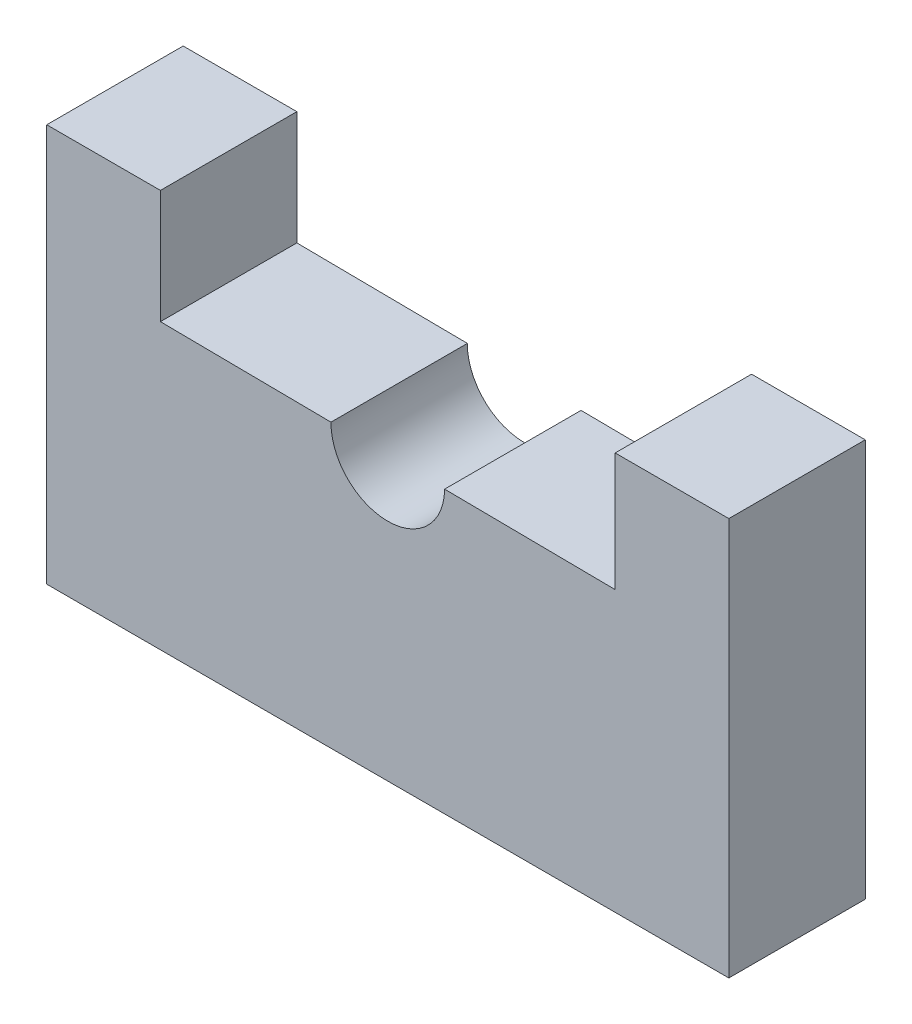
ISO-10303-21;
HEADER;
FILE_DESCRIPTION(('STEP AP214'),'2;1');
FILE_NAME('part.step','',(''),(''),'','','');
FILE_SCHEMA(('AUTOMOTIVE_DESIGN { 1 0 10303 214 1 1 1 1 }'));
ENDSEC;
DATA;
#1=APPLICATION_CONTEXT('core data for automotive mechanical design processes');
#2=APPLICATION_PROTOCOL_DEFINITION('international standard','automotive_design',2000,#1);
#3=PRODUCT_CONTEXT('',#1,'mechanical');
#4=PRODUCT('Part','Part','',(#3));
#5=PRODUCT_RELATED_PRODUCT_CATEGORY('part','',(#4));
#6=PRODUCT_DEFINITION_FORMATION('','',#4);
#7=PRODUCT_DEFINITION_CONTEXT('part definition',#1,'design');
#8=PRODUCT_DEFINITION('design','',#6,#7);
#9=PRODUCT_DEFINITION_SHAPE('','',#8);
#10=(LENGTH_UNIT() NAMED_UNIT(*) SI_UNIT(.MILLI.,.METRE.));
#11=(NAMED_UNIT(*) PLANE_ANGLE_UNIT() SI_UNIT($,.RADIAN.));
#12=(NAMED_UNIT(*) SI_UNIT($,.STERADIAN.) SOLID_ANGLE_UNIT());
#13=UNCERTAINTY_MEASURE_WITH_UNIT(LENGTH_MEASURE(1.E-05),#10,'distance_accuracy_value','');
#14=(GEOMETRIC_REPRESENTATION_CONTEXT(3) GLOBAL_UNCERTAINTY_ASSIGNED_CONTEXT((#13)) GLOBAL_UNIT_ASSIGNED_CONTEXT((#10,
#11,#12)) REPRESENTATION_CONTEXT('',''));
#15=CARTESIAN_POINT('',(0.,0.,0.));
#16=DIRECTION('',(0.,0.,1.));
#17=DIRECTION('',(1.,0.,0.));
#18=AXIS2_PLACEMENT_3D('',#15,#16,#17);
#19=CARTESIAN_POINT('',(34.1577060931899,16.9041218637993,6.));
#20=DIRECTION('',(-1.,0.,0.));
#21=DIRECTION('',(0.,-1.,0.));
#22=AXIS2_PLACEMENT_3D('',#19,#20,#21);
#23=PLANE('',#22);
#24=DIRECTION('',(0.,1.,0.));
#25=VECTOR('',#24,1.);
#26=CARTESIAN_POINT('',(34.1577060931899,16.9041218637993,-6.));
#27=LINE('',#26,#25);
#28=CARTESIAN_POINT('',(34.15770609319,-18.0958781362007,-6.));
#29=VERTEX_POINT('',#28);
#30=CARTESIAN_POINT('',(34.1577060931899,16.9041218637993,-6.));
#31=VERTEX_POINT('',#30);
#32=EDGE_CURVE('E158',#29,#31,#27,.T.);
#33=ORIENTED_EDGE('',*,*,#32,.T.);
#34=DIRECTION('',(0.,0.,-1.));
#35=VECTOR('',#34,1.);
#36=CARTESIAN_POINT('',(34.1577060931899,16.9041218637993,6.));
#37=LINE('',#36,#35);
#38=CARTESIAN_POINT('',(34.1577060931899,16.9041218637993,6.));
#39=VERTEX_POINT('',#38);
#40=EDGE_CURVE('E11',#39,#31,#37,.T.);
#41=ORIENTED_EDGE('',*,*,#40,.F.);
#42=DIRECTION('',(0.,1.,0.));
#43=VECTOR('',#42,1.);
#44=CARTESIAN_POINT('',(34.1577060931899,16.9041218637993,6.));
#45=LINE('',#44,#43);
#46=CARTESIAN_POINT('',(34.15770609319,-18.0958781362007,6.));
#47=VERTEX_POINT('',#46);
#48=EDGE_CURVE('E187',#47,#39,#45,.T.);
#49=ORIENTED_EDGE('',*,*,#48,.F.);
#50=DIRECTION('',(0.,0.,-1.));
#51=VECTOR('',#50,1.);
#52=CARTESIAN_POINT('',(34.15770609319,-18.0958781362007,6.));
#53=LINE('',#52,#51);
#54=EDGE_CURVE('E154',#47,#29,#53,.T.);
#55=ORIENTED_EDGE('',*,*,#54,.T.);
#56=EDGE_LOOP('',(#33,#41,#49,#55));
#57=FACE_BOUND('',#56,.T.);
#58=ADVANCED_FACE('F45',(#57),#23,.F.);
#59=CARTESIAN_POINT('',(24.15770609319,16.9041218637993,6.));
#60=DIRECTION('',(0.,-1.,0.));
#61=DIRECTION('',(0.,0.,-1.));
#62=AXIS2_PLACEMENT_3D('',#59,#60,#61);
#63=PLANE('',#62);
#64=DIRECTION('',(-1.,0.,0.));
#65=VECTOR('',#64,1.);
#66=CARTESIAN_POINT('',(24.15770609319,16.9041218637993,-6.));
#67=LINE('',#66,#65);
#68=CARTESIAN_POINT('',(24.15770609319,16.9041218637993,-6.));
#69=VERTEX_POINT('',#68);
#70=EDGE_CURVE('E162',#31,#69,#67,.T.);
#71=ORIENTED_EDGE('',*,*,#70,.T.);
#72=DIRECTION('',(0.,0.,-1.));
#73=VECTOR('',#72,1.);
#74=CARTESIAN_POINT('',(24.15770609319,16.9041218637993,6.));
#75=LINE('',#74,#73);
#76=CARTESIAN_POINT('',(24.15770609319,16.9041218637993,6.));
#77=VERTEX_POINT('',#76);
#78=EDGE_CURVE('E54',#77,#69,#75,.T.);
#79=ORIENTED_EDGE('',*,*,#78,.F.);
#80=DIRECTION('',(-1.,0.,0.));
#81=VECTOR('',#80,1.);
#82=CARTESIAN_POINT('',(24.15770609319,16.9041218637993,6.));
#83=LINE('',#82,#81);
#84=EDGE_CURVE('E111',#39,#77,#83,.T.);
#85=ORIENTED_EDGE('',*,*,#84,.F.);
#86=ORIENTED_EDGE('',*,*,#40,.T.);
#87=EDGE_LOOP('',(#71,#79,#85,#86));
#88=FACE_BOUND('',#87,.T.);
#89=ADVANCED_FACE('F216',(#88),#63,.F.);
#90=CARTESIAN_POINT('',(24.15770609319,6.49193548387097,6.));
#91=DIRECTION('',(1.,0.,0.));
#92=DIRECTION('',(0.,0.,-1.));
#93=AXIS2_PLACEMENT_3D('',#90,#91,#92);
#94=PLANE('',#93);
#95=DIRECTION('',(0.,-1.,0.));
#96=VECTOR('',#95,1.);
#97=CARTESIAN_POINT('',(24.15770609319,6.49193548387097,-6.));
#98=LINE('',#97,#96);
#99=CARTESIAN_POINT('',(24.15770609319,6.49193548387097,-6.));
#100=VERTEX_POINT('',#99);
#101=EDGE_CURVE('E166',#69,#100,#98,.T.);
#102=ORIENTED_EDGE('',*,*,#101,.T.);
#103=DIRECTION('',(0.,0.,-1.));
#104=VECTOR('',#103,1.);
#105=CARTESIAN_POINT('',(24.15770609319,6.49193548387097,6.));
#106=LINE('',#105,#104);
#107=CARTESIAN_POINT('',(24.15770609319,6.49193548387097,6.));
#108=VERTEX_POINT('',#107);
#109=EDGE_CURVE('E206',#108,#100,#106,.T.);
#110=ORIENTED_EDGE('',*,*,#109,.F.);
#111=DIRECTION('',(0.,-1.,0.));
#112=VECTOR('',#111,1.);
#113=CARTESIAN_POINT('',(24.15770609319,16.9041218637993,6.));
#114=LINE('',#113,#112);
#115=EDGE_CURVE('E215',#77,#108,#114,.T.);
#116=ORIENTED_EDGE('',*,*,#115,.F.);
#117=ORIENTED_EDGE('',*,*,#78,.T.);
#118=EDGE_LOOP('',(#102,#110,#116,#117));
#119=FACE_BOUND('',#118,.T.);
#120=ADVANCED_FACE('F213',(#119),#94,.F.);
#121=CARTESIAN_POINT('',(9.15744064931116,6.64650811165287,6.));
#122=DIRECTION('',(-0.0103041124364507,-0.999946911224239,0.));
#123=DIRECTION('',(0.999946911224239,-0.0103041124364507,0.));
#124=AXIS2_PLACEMENT_3D('',#121,#122,#123);
#125=PLANE('',#124);
#126=DIRECTION('',(-0.999946911224239,0.0103041124364507,0.));
#127=VECTOR('',#126,1.);
#128=CARTESIAN_POINT('',(9.15744064931116,6.64650811165287,-6.));
#129=LINE('',#128,#127);
#130=CARTESIAN_POINT('',(9.15744064931116,6.64650811165287,-6.));
#131=VERTEX_POINT('',#130);
#132=EDGE_CURVE('E169',#100,#131,#129,.T.);
#133=ORIENTED_EDGE('',*,*,#132,.T.);
#134=DIRECTION('',(0.,0.,-1.));
#135=VECTOR('',#134,1.);
#136=CARTESIAN_POINT('',(9.15744064931116,6.64650811165287,6.));
#137=LINE('',#136,#135);
#138=CARTESIAN_POINT('',(9.15744064931116,6.64650811165287,6.));
#139=VERTEX_POINT('',#138);
#140=EDGE_CURVE('E202',#139,#131,#137,.T.);
#141=ORIENTED_EDGE('',*,*,#140,.F.);
#142=DIRECTION('',(-0.999946911224239,0.0103041124364507,0.));
#143=VECTOR('',#142,1.);
#144=CARTESIAN_POINT('',(9.15744064931116,6.64650811165287,6.));
#145=LINE('',#144,#143);
#146=EDGE_CURVE('E236',#108,#139,#145,.T.);
#147=ORIENTED_EDGE('',*,*,#146,.F.);
#148=ORIENTED_EDGE('',*,*,#109,.T.);
#149=EDGE_LOOP('',(#133,#141,#147,#148));
#150=FACE_BOUND('',#149,.T.);
#151=ADVANCED_FACE('F226',(#150),#125,.F.);
#152=CARTESIAN_POINT('',(4.15770609318996,6.69802867383513,6.));
#153=DIRECTION('',(0.,0.,-1.));
#154=DIRECTION('',(-1.,0.,0.));
#155=AXIS2_PLACEMENT_3D('',#152,#153,#154);
#156=CYLINDRICAL_SURFACE('',#155,5.);
#157=CARTESIAN_POINT('',(4.15770609318996,6.69802867383513,-6.));
#158=DIRECTION('',(0.,0.,-1.));
#159=DIRECTION('',(1.,0.,0.));
#160=AXIS2_PLACEMENT_3D('',#157,#158,#159);
#161=CIRCLE('',#160,5.);
#162=CARTESIAN_POINT('',(-0.842028462931237,6.74954923601738,-6.));
#163=VERTEX_POINT('',#162);
#164=EDGE_CURVE('E172',#131,#163,#161,.T.);
#165=ORIENTED_EDGE('',*,*,#164,.T.);
#166=DIRECTION('',(0.,0.,-1.));
#167=VECTOR('',#166,1.);
#168=CARTESIAN_POINT('',(-0.842028462931237,6.74954923601738,6.));
#169=LINE('',#168,#167);
#170=CARTESIAN_POINT('',(-0.842028462931237,6.74954923601738,6.));
#171=VERTEX_POINT('',#170);
#172=EDGE_CURVE('E198',#171,#163,#169,.T.);
#173=ORIENTED_EDGE('',*,*,#172,.F.);
#174=CARTESIAN_POINT('',(4.15770609318996,6.69802867383513,6.));
#175=DIRECTION('',(0.,0.,-1.));
#176=DIRECTION('',(1.,0.,0.));
#177=AXIS2_PLACEMENT_3D('',#174,#175,#176);
#178=CIRCLE('',#177,5.);
#179=EDGE_CURVE('E232',#139,#171,#178,.T.);
#180=ORIENTED_EDGE('',*,*,#179,.F.);
#181=ORIENTED_EDGE('',*,*,#140,.T.);
#182=EDGE_LOOP('',(#165,#173,#180,#181));
#183=FACE_BOUND('',#182,.T.);
#184=ADVANCED_FACE('F230',(#183),#156,.F.);
#185=CARTESIAN_POINT('',(-15.84229390681,6.90412186379929,6.));
#186=DIRECTION('',(-0.0103041124364506,-0.999946911224239,0.));
#187=DIRECTION('',(0.99994691122424,-0.0103041124364506,0.));
#188=AXIS2_PLACEMENT_3D('',#185,#186,#187);
#189=PLANE('',#188);
#190=DIRECTION('',(-0.99994691122424,0.0103041124364507,0.));
#191=VECTOR('',#190,1.);
#192=CARTESIAN_POINT('',(-15.84229390681,6.90412186379929,-6.));
#193=LINE('',#192,#191);
#194=CARTESIAN_POINT('',(-15.84229390681,6.90412186379929,-6.));
#195=VERTEX_POINT('',#194);
#196=EDGE_CURVE('E175',#163,#195,#193,.T.);
#197=ORIENTED_EDGE('',*,*,#196,.T.);
#198=DIRECTION('',(0.,0.,-1.));
#199=VECTOR('',#198,1.);
#200=CARTESIAN_POINT('',(-15.84229390681,6.90412186379929,6.));
#201=LINE('',#200,#199);
#202=CARTESIAN_POINT('',(-15.84229390681,6.90412186379929,6.));
#203=VERTEX_POINT('',#202);
#204=EDGE_CURVE('E194',#203,#195,#201,.T.);
#205=ORIENTED_EDGE('',*,*,#204,.F.);
#206=DIRECTION('',(-0.99994691122424,0.0103041124364507,0.));
#207=VECTOR('',#206,1.);
#208=CARTESIAN_POINT('',(-15.84229390681,6.90412186379929,6.));
#209=LINE('',#208,#207);
#210=EDGE_CURVE('E235',#171,#203,#209,.T.);
#211=ORIENTED_EDGE('',*,*,#210,.F.);
#212=ORIENTED_EDGE('',*,*,#172,.T.);
#213=EDGE_LOOP('',(#197,#205,#211,#212));
#214=FACE_BOUND('',#213,.T.);
#215=ADVANCED_FACE('F257',(#214),#189,.F.);
#216=CARTESIAN_POINT('',(-15.84229390681,16.9041218637993,6.));
#217=DIRECTION('',(-1.,0.,0.));
#218=DIRECTION('',(0.,0.,1.));
#219=AXIS2_PLACEMENT_3D('',#216,#217,#218);
#220=PLANE('',#219);
#221=DIRECTION('',(0.,1.,0.));
#222=VECTOR('',#221,1.);
#223=CARTESIAN_POINT('',(-15.84229390681,16.9041218637993,-6.));
#224=LINE('',#223,#222);
#225=CARTESIAN_POINT('',(-15.84229390681,16.9041218637993,-6.));
#226=VERTEX_POINT('',#225);
#227=EDGE_CURVE('E178',#195,#226,#224,.T.);
#228=ORIENTED_EDGE('',*,*,#227,.T.);
#229=DIRECTION('',(0.,0.,-1.));
#230=VECTOR('',#229,1.);
#231=CARTESIAN_POINT('',(-15.84229390681,16.9041218637993,6.));
#232=LINE('',#231,#230);
#233=CARTESIAN_POINT('',(-15.84229390681,16.9041218637993,6.));
#234=VERTEX_POINT('',#233);
#235=EDGE_CURVE('E147',#234,#226,#232,.T.);
#236=ORIENTED_EDGE('',*,*,#235,.F.);
#237=DIRECTION('',(0.,1.,0.));
#238=VECTOR('',#237,1.);
#239=CARTESIAN_POINT('',(-15.84229390681,16.9041218637993,6.));
#240=LINE('',#239,#238);
#241=EDGE_CURVE('E136',#203,#234,#240,.T.);
#242=ORIENTED_EDGE('',*,*,#241,.F.);
#243=ORIENTED_EDGE('',*,*,#204,.T.);
#244=EDGE_LOOP('',(#228,#236,#242,#243));
#245=FACE_BOUND('',#244,.T.);
#246=ADVANCED_FACE('F254',(#245),#220,.F.);
#247=CARTESIAN_POINT('',(-25.84229390681,16.9041218637993,6.));
#248=DIRECTION('',(0.,-1.,0.));
#249=DIRECTION('',(0.,0.,-1.));
#250=AXIS2_PLACEMENT_3D('',#247,#248,#249);
#251=PLANE('',#250);
#252=DIRECTION('',(-1.,0.,0.));
#253=VECTOR('',#252,1.);
#254=CARTESIAN_POINT('',(-25.84229390681,16.9041218637993,-6.));
#255=LINE('',#254,#253);
#256=CARTESIAN_POINT('',(-25.84229390681,16.9041218637993,-6.));
#257=VERTEX_POINT('',#256);
#258=EDGE_CURVE('E145',#226,#257,#255,.T.);
#259=ORIENTED_EDGE('',*,*,#258,.T.);
#260=DIRECTION('',(0.,0.,-1.));
#261=VECTOR('',#260,1.);
#262=CARTESIAN_POINT('',(-25.84229390681,16.9041218637993,6.));
#263=LINE('',#262,#261);
#264=CARTESIAN_POINT('',(-25.84229390681,16.9041218637993,6.));
#265=VERTEX_POINT('',#264);
#266=EDGE_CURVE('E142',#265,#257,#263,.T.);
#267=ORIENTED_EDGE('',*,*,#266,.F.);
#268=DIRECTION('',(-1.,0.,0.));
#269=VECTOR('',#268,1.);
#270=CARTESIAN_POINT('',(-25.84229390681,16.9041218637993,6.));
#271=LINE('',#270,#269);
#272=EDGE_CURVE('E130',#234,#265,#271,.T.);
#273=ORIENTED_EDGE('',*,*,#272,.F.);
#274=ORIENTED_EDGE('',*,*,#235,.T.);
#275=EDGE_LOOP('',(#259,#267,#273,#274));
#276=FACE_BOUND('',#275,.T.);
#277=ADVANCED_FACE('F143',(#276),#251,.F.);
#278=CARTESIAN_POINT('',(-25.84229390681,16.9041218637993,6.));
#279=DIRECTION('',(1.,0.,0.));
#280=DIRECTION('',(0.,0.,-1.));
#281=AXIS2_PLACEMENT_3D('',#278,#279,#280);
#282=PLANE('',#281);
#283=DIRECTION('',(0.,-1.,0.));
#284=VECTOR('',#283,1.);
#285=CARTESIAN_POINT('',(-25.84229390681,16.9041218637993,-6.));
#286=LINE('',#285,#284);
#287=CARTESIAN_POINT('',(-25.84229390681,-18.0958781362007,-6.));
#288=VERTEX_POINT('',#287);
#289=EDGE_CURVE('E97',#257,#288,#286,.T.);
#290=ORIENTED_EDGE('',*,*,#289,.T.);
#291=DIRECTION('',(0.,0.,-1.));
#292=VECTOR('',#291,1.);
#293=CARTESIAN_POINT('',(-25.84229390681,-18.0958781362007,6.));
#294=LINE('',#293,#292);
#295=CARTESIAN_POINT('',(-25.84229390681,-18.0958781362007,6.));
#296=VERTEX_POINT('',#295);
#297=EDGE_CURVE('E148',#296,#288,#294,.T.);
#298=ORIENTED_EDGE('',*,*,#297,.F.);
#299=DIRECTION('',(0.,-1.,0.));
#300=VECTOR('',#299,1.);
#301=CARTESIAN_POINT('',(-25.84229390681,16.9041218637993,6.));
#302=LINE('',#301,#300);
#303=EDGE_CURVE('E134',#265,#296,#302,.T.);
#304=ORIENTED_EDGE('',*,*,#303,.F.);
#305=ORIENTED_EDGE('',*,*,#266,.T.);
#306=EDGE_LOOP('',(#290,#298,#304,#305));
#307=FACE_BOUND('',#306,.T.);
#308=ADVANCED_FACE('F150',(#307),#282,.F.);
#309=CARTESIAN_POINT('',(-25.84229390681,-18.0958781362007,6.));
#310=DIRECTION('',(0.,1.,0.));
#311=DIRECTION('',(0.,0.,1.));
#312=AXIS2_PLACEMENT_3D('',#309,#310,#311);
#313=PLANE('',#312);
#314=DIRECTION('',(1.,0.,0.));
#315=VECTOR('',#314,1.);
#316=CARTESIAN_POINT('',(-25.84229390681,-18.0958781362007,-6.));
#317=LINE('',#316,#315);
#318=EDGE_CURVE('E103',#288,#29,#317,.T.);
#319=ORIENTED_EDGE('',*,*,#318,.T.);
#320=ORIENTED_EDGE('',*,*,#54,.F.);
#321=DIRECTION('',(1.,0.,0.));
#322=VECTOR('',#321,1.);
#323=CARTESIAN_POINT('',(-25.84229390681,-18.0958781362007,6.));
#324=LINE('',#323,#322);
#325=EDGE_CURVE('E62',#296,#47,#324,.T.);
#326=ORIENTED_EDGE('',*,*,#325,.F.);
#327=ORIENTED_EDGE('',*,*,#297,.T.);
#328=EDGE_LOOP('',(#319,#320,#326,#327));
#329=FACE_BOUND('',#328,.T.);
#330=ADVANCED_FACE('F251',(#329),#313,.F.);
#331=CARTESIAN_POINT('',(4.15770609318996,6.69802867383513,6.));
#332=DIRECTION('',(0.,0.,1.));
#333=DIRECTION('',(1.,0.,0.));
#334=AXIS2_PLACEMENT_3D('',#331,#332,#333);
#335=PLANE('',#334);
#336=ORIENTED_EDGE('',*,*,#48,.T.);
#337=ORIENTED_EDGE('',*,*,#84,.T.);
#338=ORIENTED_EDGE('',*,*,#115,.T.);
#339=ORIENTED_EDGE('',*,*,#146,.T.);
#340=ORIENTED_EDGE('',*,*,#179,.T.);
#341=ORIENTED_EDGE('',*,*,#210,.T.);
#342=ORIENTED_EDGE('',*,*,#241,.T.);
#343=ORIENTED_EDGE('',*,*,#272,.T.);
#344=ORIENTED_EDGE('',*,*,#303,.T.);
#345=ORIENTED_EDGE('',*,*,#325,.T.);
#346=EDGE_LOOP('',(#336,#337,#338,#339,#340,#341,#342,#343,#344,#345));
#347=FACE_BOUND('',#346,.T.);
#348=ADVANCED_FACE('F132',(#347),#335,.T.);
#349=CARTESIAN_POINT('',(4.15770609318996,6.69802867383513,-6.));
#350=DIRECTION('',(0.,0.,1.));
#351=DIRECTION('',(1.,0.,0.));
#352=AXIS2_PLACEMENT_3D('',#349,#350,#351);
#353=PLANE('',#352);
#354=ORIENTED_EDGE('',*,*,#32,.F.);
#355=ORIENTED_EDGE('',*,*,#318,.F.);
#356=ORIENTED_EDGE('',*,*,#289,.F.);
#357=ORIENTED_EDGE('',*,*,#258,.F.);
#358=ORIENTED_EDGE('',*,*,#227,.F.);
#359=ORIENTED_EDGE('',*,*,#196,.F.);
#360=ORIENTED_EDGE('',*,*,#164,.F.);
#361=ORIENTED_EDGE('',*,*,#132,.F.);
#362=ORIENTED_EDGE('',*,*,#101,.F.);
#363=ORIENTED_EDGE('',*,*,#70,.F.);
#364=EDGE_LOOP('',(#354,#355,#356,#357,#358,#359,#360,#361,#362,#363));
#365=FACE_BOUND('',#364,.T.);
#366=ADVANCED_FACE('F220',(#365),#353,.F.);
#367=CLOSED_SHELL('',(#58,#89,#120,#151,#184,#215,#246,#277,#308,#330,#348,#366));
#368=MANIFOLD_SOLID_BREP('B2',#367);
#369=ADVANCED_BREP_SHAPE_REPRESENTATION('',(#18,#368),#14);
#370=SHAPE_DEFINITION_REPRESENTATION(#9,#369);
ENDSEC;
END-ISO-10303-21;
